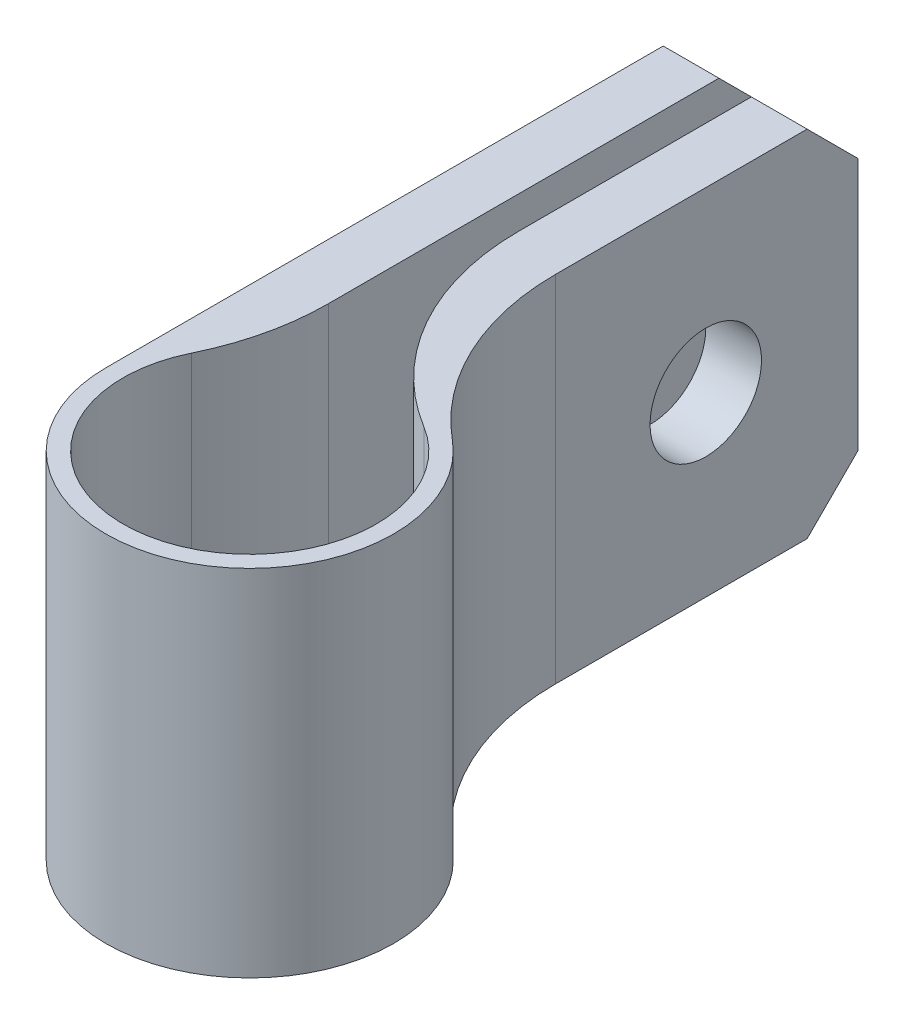
ISO-10303-21;
HEADER;
FILE_DESCRIPTION(('STEP AP214'),'2;1');
FILE_NAME('part.step','',(''),(''),'','','');
FILE_SCHEMA(('AUTOMOTIVE_DESIGN { 1 0 10303 214 1 1 1 1 }'));
ENDSEC;
DATA;
#1=APPLICATION_CONTEXT('core data for automotive mechanical design processes');
#2=APPLICATION_PROTOCOL_DEFINITION('international standard','automotive_design',2000,#1);
#3=PRODUCT_CONTEXT('',#1,'mechanical');
#4=PRODUCT('Part','Part','',(#3));
#5=PRODUCT_RELATED_PRODUCT_CATEGORY('part','',(#4));
#6=PRODUCT_DEFINITION_FORMATION('','',#4);
#7=PRODUCT_DEFINITION_CONTEXT('part definition',#1,'design');
#8=PRODUCT_DEFINITION('design','',#6,#7);
#9=PRODUCT_DEFINITION_SHAPE('','',#8);
#10=(LENGTH_UNIT() NAMED_UNIT(*) SI_UNIT(.MILLI.,.METRE.));
#11=(NAMED_UNIT(*) PLANE_ANGLE_UNIT() SI_UNIT($,.RADIAN.));
#12=(NAMED_UNIT(*) SI_UNIT($,.STERADIAN.) SOLID_ANGLE_UNIT());
#13=UNCERTAINTY_MEASURE_WITH_UNIT(LENGTH_MEASURE(1.E-05),#10,'distance_accuracy_value','');
#14=(GEOMETRIC_REPRESENTATION_CONTEXT(3) GLOBAL_UNCERTAINTY_ASSIGNED_CONTEXT((#13)) GLOBAL_UNIT_ASSIGNED_CONTEXT((#10,
#11,#12)) REPRESENTATION_CONTEXT('',''));
#15=CARTESIAN_POINT('',(0.,0.,0.));
#16=DIRECTION('',(0.,0.,1.));
#17=DIRECTION('',(1.,0.,0.));
#18=AXIS2_PLACEMENT_3D('',#15,#16,#17);
#19=CARTESIAN_POINT('',(0.,7.,0.));
#20=DIRECTION('',(0.,-1.,0.));
#21=DIRECTION('',(0.,0.,-1.));
#22=AXIS2_PLACEMENT_3D('',#19,#20,#21);
#23=CYLINDRICAL_SURFACE('',#22,5.68);
#24=CARTESIAN_POINT('',(0.,-7.,0.));
#25=DIRECTION('',(0.,1.,0.));
#26=DIRECTION('',(0.,0.,1.));
#27=AXIS2_PLACEMENT_3D('',#24,#25,#26);
#28=CIRCLE('',#27,5.68);
#29=CARTESIAN_POINT('',(-5.68,-7.,0.));
#30=VERTEX_POINT('',#29);
#31=CARTESIAN_POINT('',(3.62244897959184,-7.,-4.3749586729767));
#32=VERTEX_POINT('',#31);
#33=EDGE_CURVE('E164',#30,#32,#28,.T.);
#34=ORIENTED_EDGE('',*,*,#33,.T.);
#35=DIRECTION('',(0.,-1.,0.));
#36=VECTOR('',#35,1.);
#37=CARTESIAN_POINT('',(3.62244897959184,7.,-4.3749586729767));
#38=LINE('',#37,#36);
#39=CARTESIAN_POINT('',(3.62244897959184,7.,-4.3749586729767));
#40=VERTEX_POINT('',#39);
#41=EDGE_CURVE('E149',#32,#40,#38,.F.);
#42=ORIENTED_EDGE('',*,*,#41,.T.);
#43=CARTESIAN_POINT('',(0.,7.,0.));
#44=DIRECTION('',(0.,1.,0.));
#45=DIRECTION('',(0.,0.,1.));
#46=AXIS2_PLACEMENT_3D('',#43,#44,#45);
#47=CIRCLE('',#46,5.68);
#48=CARTESIAN_POINT('',(-5.68,7.,0.));
#49=VERTEX_POINT('',#48);
#50=EDGE_CURVE('E131',#49,#40,#47,.T.);
#51=ORIENTED_EDGE('',*,*,#50,.F.);
#52=DIRECTION('',(0.,-1.,0.));
#53=VECTOR('',#52,1.);
#54=CARTESIAN_POINT('',(-5.68,7.,0.));
#55=LINE('',#54,#53);
#56=EDGE_CURVE('E137',#49,#30,#55,.T.);
#57=ORIENTED_EDGE('',*,*,#56,.T.);
#58=EDGE_LOOP('',(#34,#42,#51,#57));
#59=FACE_BOUND('',#58,.T.);
#60=ADVANCED_FACE('F17',(#59),#23,.T.);
#61=CARTESIAN_POINT('',(0.,7.,-24.));
#62=DIRECTION('',(-1.,0.,0.));
#63=DIRECTION('',(0.,0.,1.));
#64=AXIS2_PLACEMENT_3D('',#61,#62,#63);
#65=PLANE('',#64);
#66=CARTESIAN_POINT('',(0.,0.,-18.));
#67=DIRECTION('',(-1.,0.,0.));
#68=DIRECTION('',(0.,0.,1.));
#69=AXIS2_PLACEMENT_3D('',#66,#67,#68);
#70=CIRCLE('',#69,2.2);
#71=CARTESIAN_POINT('',(0.,0.,-15.8));
#72=VERTEX_POINT('',#71);
#73=EDGE_CURVE('E157',#72,#72,#70,.T.);
#74=ORIENTED_EDGE('',*,*,#73,.T.);
#75=EDGE_LOOP('',(#74));
#76=FACE_BOUND('',#75,.T.);
#77=DIRECTION('',(0.,-1.,0.));
#78=VECTOR('',#77,1.);
#79=CARTESIAN_POINT('',(0.,7.,-24.));
#80=LINE('',#79,#78);
#81=CARTESIAN_POINT('',(0.,5.,-24.));
#82=VERTEX_POINT('',#81);
#83=CARTESIAN_POINT('',(0.,-5.,-24.));
#84=VERTEX_POINT('',#83);
#85=EDGE_CURVE('E181',#82,#84,#80,.T.);
#86=ORIENTED_EDGE('',*,*,#85,.F.);
#87=DIRECTION('',(0.,0.707106781186549,0.707106781186546));
#88=VECTOR('',#87,1.);
#89=CARTESIAN_POINT('',(0.,7.,-22.));
#90=LINE('',#89,#88);
#91=CARTESIAN_POINT('',(0.,7.,-22.));
#92=VERTEX_POINT('',#91);
#93=EDGE_CURVE('E229',#82,#92,#90,.T.);
#94=ORIENTED_EDGE('',*,*,#93,.T.);
#95=DIRECTION('',(0.,0.,-1.));
#96=VECTOR('',#95,1.);
#97=CARTESIAN_POINT('',(0.,7.,-24.));
#98=LINE('',#97,#96);
#99=CARTESIAN_POINT('',(0.,7.,-12.0773507028653));
#100=VERTEX_POINT('',#99);
#101=EDGE_CURVE('E150',#100,#92,#98,.T.);
#102=ORIENTED_EDGE('',*,*,#101,.F.);
#103=DIRECTION('',(0.,1.,0.));
#104=VECTOR('',#103,1.);
#105=CARTESIAN_POINT('',(0.,-7.,-12.0773507028653));
#106=LINE('',#105,#104);
#107=CARTESIAN_POINT('',(0.,-7.,-12.0773507028653));
#108=VERTEX_POINT('',#107);
#109=EDGE_CURVE('E184',#100,#108,#106,.F.);
#110=ORIENTED_EDGE('',*,*,#109,.T.);
#111=DIRECTION('',(0.,0.,-1.));
#112=VECTOR('',#111,1.);
#113=CARTESIAN_POINT('',(0.,-7.,-24.));
#114=LINE('',#113,#112);
#115=CARTESIAN_POINT('',(0.,-7.,-22.));
#116=VERTEX_POINT('',#115);
#117=EDGE_CURVE('E166',#108,#116,#114,.T.);
#118=ORIENTED_EDGE('',*,*,#117,.T.);
#119=DIRECTION('',(0.,-0.707106781186546,0.707106781186549));
#120=VECTOR('',#119,1.);
#121=CARTESIAN_POINT('',(0.,-5.,-24.));
#122=LINE('',#121,#120);
#123=EDGE_CURVE('E227',#116,#84,#122,.F.);
#124=ORIENTED_EDGE('',*,*,#123,.T.);
#125=EDGE_LOOP('',(#86,#94,#102,#110,#118,#124));
#126=FACE_BOUND('',#125,.T.);
#127=ADVANCED_FACE('F250',(#76,#126),#65,.F.);
#128=CARTESIAN_POINT('',(-2.2,7.,-24.));
#129=DIRECTION('',(0.,0.,1.));
#130=DIRECTION('',(1.,0.,0.));
#131=AXIS2_PLACEMENT_3D('',#128,#129,#130);
#132=PLANE('',#131);
#133=DIRECTION('',(0.,-1.,0.));
#134=VECTOR('',#133,1.);
#135=CARTESIAN_POINT('',(-2.2,7.,-24.));
#136=LINE('',#135,#134);
#137=CARTESIAN_POINT('',(-2.2,5.,-24.));
#138=VERTEX_POINT('',#137);
#139=CARTESIAN_POINT('',(-2.2,-5.,-24.));
#140=VERTEX_POINT('',#139);
#141=EDGE_CURVE('E178',#138,#140,#136,.T.);
#142=ORIENTED_EDGE('',*,*,#141,.F.);
#143=DIRECTION('',(1.,0.,0.));
#144=VECTOR('',#143,1.);
#145=CARTESIAN_POINT('',(0.,5.,-24.));
#146=LINE('',#145,#144);
#147=EDGE_CURVE('E225',#138,#82,#146,.T.);
#148=ORIENTED_EDGE('',*,*,#147,.T.);
#149=ORIENTED_EDGE('',*,*,#85,.T.);
#150=DIRECTION('',(-1.,0.,0.));
#151=VECTOR('',#150,1.);
#152=CARTESIAN_POINT('',(-2.2,-5.,-24.));
#153=LINE('',#152,#151);
#154=EDGE_CURVE('E222',#84,#140,#153,.T.);
#155=ORIENTED_EDGE('',*,*,#154,.T.);
#156=EDGE_LOOP('',(#142,#148,#149,#155));
#157=FACE_BOUND('',#156,.T.);
#158=ADVANCED_FACE('F256',(#157),#132,.F.);
#159=CARTESIAN_POINT('',(-2.2,7.,-24.));
#160=DIRECTION('',(1.,0.,0.));
#161=DIRECTION('',(0.,0.,-1.));
#162=AXIS2_PLACEMENT_3D('',#159,#160,#161);
#163=PLANE('',#162);
#164=CARTESIAN_POINT('',(-2.2,0.,-18.));
#165=DIRECTION('',(1.,0.,0.));
#166=DIRECTION('',(0.,0.,-1.));
#167=AXIS2_PLACEMENT_3D('',#164,#165,#166);
#168=CIRCLE('',#167,2.2);
#169=CARTESIAN_POINT('',(-2.2,0.,-20.2));
#170=VERTEX_POINT('',#169);
#171=EDGE_CURVE('E457',#170,#170,#168,.T.);
#172=ORIENTED_EDGE('',*,*,#171,.T.);
#173=EDGE_LOOP('',(#172));
#174=FACE_BOUND('',#173,.T.);
#175=DIRECTION('',(0.,0.,1.));
#176=VECTOR('',#175,1.);
#177=CARTESIAN_POINT('',(-2.2,7.,-24.));
#178=LINE('',#177,#176);
#179=CARTESIAN_POINT('',(-2.2,7.,-22.));
#180=VERTEX_POINT('',#179);
#181=CARTESIAN_POINT('',(-2.2,7.,-12.8124939024376));
#182=VERTEX_POINT('',#181);
#183=EDGE_CURVE('E152',#180,#182,#178,.T.);
#184=ORIENTED_EDGE('',*,*,#183,.F.);
#185=DIRECTION('',(0.,-0.707106781186549,-0.707106781186546));
#186=VECTOR('',#185,1.);
#187=CARTESIAN_POINT('',(-2.2,7.,-22.));
#188=LINE('',#187,#186);
#189=EDGE_CURVE('E220',#180,#138,#188,.T.);
#190=ORIENTED_EDGE('',*,*,#189,.T.);
#191=ORIENTED_EDGE('',*,*,#141,.T.);
#192=DIRECTION('',(0.,0.707106781186546,-0.707106781186549));
#193=VECTOR('',#192,1.);
#194=CARTESIAN_POINT('',(-2.2,-5.,-24.));
#195=LINE('',#194,#193);
#196=CARTESIAN_POINT('',(-2.2,-7.,-22.));
#197=VERTEX_POINT('',#196);
#198=EDGE_CURVE('E218',#140,#197,#195,.F.);
#199=ORIENTED_EDGE('',*,*,#198,.T.);
#200=DIRECTION('',(0.,0.,1.));
#201=VECTOR('',#200,1.);
#202=CARTESIAN_POINT('',(-2.2,-7.,-24.));
#203=LINE('',#202,#201);
#204=CARTESIAN_POINT('',(-2.2,-7.,-12.8124939024376));
#205=VERTEX_POINT('',#204);
#206=EDGE_CURVE('E169',#197,#205,#203,.T.);
#207=ORIENTED_EDGE('',*,*,#206,.T.);
#208=DIRECTION('',(0.,-1.,0.));
#209=VECTOR('',#208,1.);
#210=CARTESIAN_POINT('',(-2.2,7.,-12.8124939024376));
#211=LINE('',#210,#209);
#212=EDGE_CURVE('E209',#205,#182,#211,.F.);
#213=ORIENTED_EDGE('',*,*,#212,.T.);
#214=EDGE_LOOP('',(#184,#190,#191,#199,#207,#213));
#215=FACE_BOUND('',#214,.T.);
#216=ADVANCED_FACE('F260',(#174,#215),#163,.F.);
#217=CARTESIAN_POINT('',(0.,7.,0.));
#218=DIRECTION('',(0.,-1.,0.));
#219=DIRECTION('',(0.,0.,-1.));
#220=AXIS2_PLACEMENT_3D('',#217,#218,#219);
#221=CYLINDRICAL_SURFACE('',#220,5.);
#222=CARTESIAN_POINT('',(0.,7.,0.));
#223=DIRECTION('',(0.,-1.,0.));
#224=DIRECTION('',(0.,0.,1.));
#225=AXIS2_PLACEMENT_3D('',#222,#223,#224);
#226=CIRCLE('',#225,5.);
#227=CARTESIAN_POINT('',(2.6,7.,-4.27083130081253));
#228=VERTEX_POINT('',#227);
#229=CARTESIAN_POINT('',(-4.49333333333333,7.,-2.19316108746156));
#230=VERTEX_POINT('',#229);
#231=EDGE_CURVE('E161',#228,#230,#226,.T.);
#232=ORIENTED_EDGE('',*,*,#231,.F.);
#233=DIRECTION('',(0.,-1.,0.));
#234=VECTOR('',#233,1.);
#235=CARTESIAN_POINT('',(2.6,7.,-4.27083130081253));
#236=LINE('',#235,#234);
#237=CARTESIAN_POINT('',(2.6,-7.,-4.27083130081253));
#238=VERTEX_POINT('',#237);
#239=EDGE_CURVE('E203',#228,#238,#236,.T.);
#240=ORIENTED_EDGE('',*,*,#239,.T.);
#241=CARTESIAN_POINT('',(0.,-7.,0.));
#242=DIRECTION('',(0.,-1.,0.));
#243=DIRECTION('',(0.,0.,1.));
#244=AXIS2_PLACEMENT_3D('',#241,#242,#243);
#245=CIRCLE('',#244,5.);
#246=CARTESIAN_POINT('',(-4.49333333333333,-7.,-2.19316108746156));
#247=VERTEX_POINT('',#246);
#248=EDGE_CURVE('E171',#238,#247,#245,.T.);
#249=ORIENTED_EDGE('',*,*,#248,.T.);
#250=DIRECTION('',(0.,-1.,0.));
#251=VECTOR('',#250,1.);
#252=CARTESIAN_POINT('',(-4.49333333333333,7.,-2.19316108746156));
#253=LINE('',#252,#251);
#254=EDGE_CURVE('E194',#247,#230,#253,.F.);
#255=ORIENTED_EDGE('',*,*,#254,.T.);
#256=EDGE_LOOP('',(#232,#240,#249,#255));
#257=FACE_BOUND('',#256,.T.);
#258=ADVANCED_FACE('F288',(#257),#221,.F.);
#259=CARTESIAN_POINT('',(-3.48,7.,-24.));
#260=DIRECTION('',(-1.,0.,0.));
#261=DIRECTION('',(0.,0.,1.));
#262=AXIS2_PLACEMENT_3D('',#259,#260,#261);
#263=PLANE('',#262);
#264=CARTESIAN_POINT('',(-3.48,0.,-18.));
#265=DIRECTION('',(-1.,0.,0.));
#266=DIRECTION('',(0.,0.,1.));
#267=AXIS2_PLACEMENT_3D('',#264,#265,#266);
#268=CIRCLE('',#267,2.2);
#269=CARTESIAN_POINT('',(-3.48,0.,-15.8));
#270=VERTEX_POINT('',#269);
#271=EDGE_CURVE('E460',#270,#270,#268,.T.);
#272=ORIENTED_EDGE('',*,*,#271,.T.);
#273=EDGE_LOOP('',(#272));
#274=FACE_BOUND('',#273,.T.);
#275=DIRECTION('',(0.,-1.,0.));
#276=VECTOR('',#275,1.);
#277=CARTESIAN_POINT('',(-3.48,7.,-24.));
#278=LINE('',#277,#276);
#279=CARTESIAN_POINT('',(-3.48,5.,-24.));
#280=VERTEX_POINT('',#279);
#281=CARTESIAN_POINT('',(-3.48,-5.,-24.));
#282=VERTEX_POINT('',#281);
#283=EDGE_CURVE('E176',#280,#282,#278,.T.);
#284=ORIENTED_EDGE('',*,*,#283,.F.);
#285=DIRECTION('',(0.,0.70710678118655,0.707106781186546));
#286=VECTOR('',#285,1.);
#287=CARTESIAN_POINT('',(-3.48,7.,-22.));
#288=LINE('',#287,#286);
#289=CARTESIAN_POINT('',(-3.48,7.,-22.));
#290=VERTEX_POINT('',#289);
#291=EDGE_CURVE('E241',#280,#290,#288,.T.);
#292=ORIENTED_EDGE('',*,*,#291,.T.);
#293=DIRECTION('',(0.,0.,-1.));
#294=VECTOR('',#293,1.);
#295=CARTESIAN_POINT('',(-3.48,7.,-24.));
#296=LINE('',#295,#294);
#297=CARTESIAN_POINT('',(-3.48,7.,-6.57948326238469));
#298=VERTEX_POINT('',#297);
#299=EDGE_CURVE('E138',#298,#290,#296,.T.);
#300=ORIENTED_EDGE('',*,*,#299,.F.);
#301=DIRECTION('',(0.,-1.,0.));
#302=VECTOR('',#301,1.);
#303=CARTESIAN_POINT('',(-3.48,7.,-6.57948326238468));
#304=LINE('',#303,#302);
#305=CARTESIAN_POINT('',(-3.48,-7.,-6.57948326238469));
#306=VERTEX_POINT('',#305);
#307=EDGE_CURVE('E188',#298,#306,#304,.T.);
#308=ORIENTED_EDGE('',*,*,#307,.T.);
#309=DIRECTION('',(0.,0.,-1.));
#310=VECTOR('',#309,1.);
#311=CARTESIAN_POINT('',(-3.48,-7.,-24.));
#312=LINE('',#311,#310);
#313=CARTESIAN_POINT('',(-3.48,-7.,-22.));
#314=VERTEX_POINT('',#313);
#315=EDGE_CURVE('E154',#306,#314,#312,.T.);
#316=ORIENTED_EDGE('',*,*,#315,.T.);
#317=DIRECTION('',(0.,-0.707106781186546,0.707106781186549));
#318=VECTOR('',#317,1.);
#319=CARTESIAN_POINT('',(-3.48,-5.,-24.));
#320=LINE('',#319,#318);
#321=EDGE_CURVE('E37',#314,#282,#320,.F.);
#322=ORIENTED_EDGE('',*,*,#321,.T.);
#323=EDGE_LOOP('',(#284,#292,#300,#308,#316,#322));
#324=FACE_BOUND('',#323,.T.);
#325=ADVANCED_FACE('F277',(#274,#324),#263,.F.);
#326=CARTESIAN_POINT('',(-5.68,7.,-24.));
#327=DIRECTION('',(0.,0.,1.));
#328=DIRECTION('',(1.,0.,0.));
#329=AXIS2_PLACEMENT_3D('',#326,#327,#328);
#330=PLANE('',#329);
#331=DIRECTION('',(0.,-1.,0.));
#332=VECTOR('',#331,1.);
#333=CARTESIAN_POINT('',(-5.68,7.,-24.));
#334=LINE('',#333,#332);
#335=CARTESIAN_POINT('',(-5.68,5.,-24.));
#336=VERTEX_POINT('',#335);
#337=CARTESIAN_POINT('',(-5.68,-5.,-24.));
#338=VERTEX_POINT('',#337);
#339=EDGE_CURVE('E146',#336,#338,#334,.T.);
#340=ORIENTED_EDGE('',*,*,#339,.F.);
#341=DIRECTION('',(1.,0.,0.));
#342=VECTOR('',#341,1.);
#343=CARTESIAN_POINT('',(-3.48,5.,-24.));
#344=LINE('',#343,#342);
#345=EDGE_CURVE('E238',#336,#280,#344,.T.);
#346=ORIENTED_EDGE('',*,*,#345,.T.);
#347=ORIENTED_EDGE('',*,*,#283,.T.);
#348=DIRECTION('',(-1.,0.,0.));
#349=VECTOR('',#348,1.);
#350=CARTESIAN_POINT('',(-5.68,-5.,-24.));
#351=LINE('',#350,#349);
#352=EDGE_CURVE('E235',#282,#338,#351,.T.);
#353=ORIENTED_EDGE('',*,*,#352,.T.);
#354=EDGE_LOOP('',(#340,#346,#347,#353));
#355=FACE_BOUND('',#354,.T.);
#356=ADVANCED_FACE('F272',(#355),#330,.F.);
#357=CARTESIAN_POINT('',(-5.68,7.,0.));
#358=DIRECTION('',(1.,0.,0.));
#359=DIRECTION('',(0.,0.,-1.));
#360=AXIS2_PLACEMENT_3D('',#357,#358,#359);
#361=PLANE('',#360);
#362=CARTESIAN_POINT('',(-5.68,0.,-18.));
#363=DIRECTION('',(1.,0.,0.));
#364=DIRECTION('',(0.,0.,-1.));
#365=AXIS2_PLACEMENT_3D('',#362,#363,#364);
#366=CIRCLE('',#365,2.2);
#367=CARTESIAN_POINT('',(-5.68,0.,-20.2));
#368=VERTEX_POINT('',#367);
#369=EDGE_CURVE('E462',#368,#368,#366,.T.);
#370=ORIENTED_EDGE('',*,*,#369,.T.);
#371=EDGE_LOOP('',(#370));
#372=FACE_BOUND('',#371,.T.);
#373=DIRECTION('',(0.,0.,1.));
#374=VECTOR('',#373,1.);
#375=CARTESIAN_POINT('',(-5.68,7.,0.));
#376=LINE('',#375,#374);
#377=CARTESIAN_POINT('',(-5.68,7.,-22.));
#378=VERTEX_POINT('',#377);
#379=EDGE_CURVE('E126',#378,#49,#376,.T.);
#380=ORIENTED_EDGE('',*,*,#379,.F.);
#381=DIRECTION('',(0.,-0.707106781186549,-0.707106781186546));
#382=VECTOR('',#381,1.);
#383=CARTESIAN_POINT('',(-5.68,7.,-22.));
#384=LINE('',#383,#382);
#385=EDGE_CURVE('E233',#378,#336,#384,.T.);
#386=ORIENTED_EDGE('',*,*,#385,.T.);
#387=ORIENTED_EDGE('',*,*,#339,.T.);
#388=DIRECTION('',(0.,0.707106781186546,-0.707106781186549));
#389=VECTOR('',#388,1.);
#390=CARTESIAN_POINT('',(-5.68,-5.,-24.));
#391=LINE('',#390,#389);
#392=CARTESIAN_POINT('',(-5.68,-7.,-22.));
#393=VERTEX_POINT('',#392);
#394=EDGE_CURVE('E231',#338,#393,#391,.F.);
#395=ORIENTED_EDGE('',*,*,#394,.T.);
#396=DIRECTION('',(0.,0.,1.));
#397=VECTOR('',#396,1.);
#398=CARTESIAN_POINT('',(-5.68,-7.,0.));
#399=LINE('',#398,#397);
#400=EDGE_CURVE('E142',#393,#30,#399,.T.);
#401=ORIENTED_EDGE('',*,*,#400,.T.);
#402=ORIENTED_EDGE('',*,*,#56,.F.);
#403=EDGE_LOOP('',(#380,#386,#387,#395,#401,#402));
#404=FACE_BOUND('',#403,.T.);
#405=ADVANCED_FACE('F141',(#372,#404),#361,.F.);
#406=CARTESIAN_POINT('',(0.,7.,0.));
#407=DIRECTION('',(0.,1.,0.));
#408=DIRECTION('',(0.,0.,1.));
#409=AXIS2_PLACEMENT_3D('',#406,#407,#408);
#410=PLANE('',#409);
#411=ORIENTED_EDGE('',*,*,#101,.T.);
#412=DIRECTION('',(-1.,0.,0.));
#413=VECTOR('',#412,1.);
#414=CARTESIAN_POINT('',(-2.2,7.,-22.));
#415=LINE('',#414,#413);
#416=EDGE_CURVE('E215',#92,#180,#415,.T.);
#417=ORIENTED_EDGE('',*,*,#416,.T.);
#418=ORIENTED_EDGE('',*,*,#183,.T.);
#419=CARTESIAN_POINT('',(7.8,7.,-12.8124939024376));
#420=DIRECTION('',(0.,1.,0.));
#421=DIRECTION('',(0.,0.,1.));
#422=AXIS2_PLACEMENT_3D('',#419,#420,#421);
#423=CIRCLE('',#422,10.);
#424=EDGE_CURVE('E212',#182,#228,#423,.T.);
#425=ORIENTED_EDGE('',*,*,#424,.T.);
#426=ORIENTED_EDGE('',*,*,#231,.T.);
#427=CARTESIAN_POINT('',(-13.48,7.,-6.57948326238468));
#428=DIRECTION('',(0.,1.,0.));
#429=DIRECTION('',(0.,0.,1.));
#430=AXIS2_PLACEMENT_3D('',#427,#428,#429);
#431=CIRCLE('',#430,10.);
#432=EDGE_CURVE('E197',#230,#298,#431,.T.);
#433=ORIENTED_EDGE('',*,*,#432,.T.);
#434=ORIENTED_EDGE('',*,*,#299,.T.);
#435=DIRECTION('',(-1.,0.,0.));
#436=VECTOR('',#435,1.);
#437=CARTESIAN_POINT('',(-5.68,7.,-22.));
#438=LINE('',#437,#436);
#439=EDGE_CURVE('E135',#290,#378,#438,.T.);
#440=ORIENTED_EDGE('',*,*,#439,.T.);
#441=ORIENTED_EDGE('',*,*,#379,.T.);
#442=ORIENTED_EDGE('',*,*,#50,.T.);
#443=CARTESIAN_POINT('',(10.,7.,-12.0773507028653));
#444=DIRECTION('',(0.,1.,0.));
#445=DIRECTION('',(0.,0.,1.));
#446=AXIS2_PLACEMENT_3D('',#443,#444,#445);
#447=CIRCLE('',#446,10.);
#448=EDGE_CURVE('E201',#40,#100,#447,.F.);
#449=ORIENTED_EDGE('',*,*,#448,.T.);
#450=EDGE_LOOP('',(#411,#417,#418,#425,#426,#433,#434,#440,#441,#442,#449));
#451=FACE_BOUND('',#450,.T.);
#452=ADVANCED_FACE('F129',(#451),#410,.T.);
#453=CARTESIAN_POINT('',(0.,-7.,0.));
#454=DIRECTION('',(0.,1.,0.));
#455=DIRECTION('',(0.,0.,1.));
#456=AXIS2_PLACEMENT_3D('',#453,#454,#455);
#457=PLANE('',#456);
#458=ORIENTED_EDGE('',*,*,#400,.F.);
#459=DIRECTION('',(1.,0.,0.));
#460=VECTOR('',#459,1.);
#461=CARTESIAN_POINT('',(0.,-7.,-22.));
#462=LINE('',#461,#460);
#463=EDGE_CURVE('E11',#393,#314,#462,.T.);
#464=ORIENTED_EDGE('',*,*,#463,.T.);
#465=ORIENTED_EDGE('',*,*,#315,.F.);
#466=CARTESIAN_POINT('',(-13.48,-7.,-6.57948326238468));
#467=DIRECTION('',(0.,1.,0.));
#468=DIRECTION('',(0.,0.,1.));
#469=AXIS2_PLACEMENT_3D('',#466,#467,#468);
#470=CIRCLE('',#469,10.);
#471=EDGE_CURVE('E191',#306,#247,#470,.F.);
#472=ORIENTED_EDGE('',*,*,#471,.T.);
#473=ORIENTED_EDGE('',*,*,#248,.F.);
#474=CARTESIAN_POINT('',(7.8,-7.,-12.8124939024376));
#475=DIRECTION('',(0.,1.,0.));
#476=DIRECTION('',(0.,0.,1.));
#477=AXIS2_PLACEMENT_3D('',#474,#475,#476);
#478=CIRCLE('',#477,10.);
#479=EDGE_CURVE('E206',#238,#205,#478,.F.);
#480=ORIENTED_EDGE('',*,*,#479,.T.);
#481=ORIENTED_EDGE('',*,*,#206,.F.);
#482=DIRECTION('',(1.,0.,0.));
#483=VECTOR('',#482,1.);
#484=CARTESIAN_POINT('',(0.,-7.,-22.));
#485=LINE('',#484,#483);
#486=EDGE_CURVE('E25',#197,#116,#485,.T.);
#487=ORIENTED_EDGE('',*,*,#486,.T.);
#488=ORIENTED_EDGE('',*,*,#117,.F.);
#489=CARTESIAN_POINT('',(10.,-7.,-12.0773507028653));
#490=DIRECTION('',(0.,1.,0.));
#491=DIRECTION('',(0.,0.,1.));
#492=AXIS2_PLACEMENT_3D('',#489,#490,#491);
#493=CIRCLE('',#492,10.);
#494=EDGE_CURVE('E199',#108,#32,#493,.T.);
#495=ORIENTED_EDGE('',*,*,#494,.T.);
#496=ORIENTED_EDGE('',*,*,#33,.F.);
#497=EDGE_LOOP('',(#458,#464,#465,#472,#473,#480,#481,#487,#488,#495,#496));
#498=FACE_BOUND('',#497,.T.);
#499=ADVANCED_FACE('F245',(#498),#457,.F.);
#500=CARTESIAN_POINT('',(10.,7.,-12.0773507028653));
#501=DIRECTION('',(0.,-1.,0.));
#502=DIRECTION('',(0.,0.,-1.));
#503=AXIS2_PLACEMENT_3D('',#500,#501,#502);
#504=CYLINDRICAL_SURFACE('',#503,10.);
#505=ORIENTED_EDGE('',*,*,#448,.F.);
#506=ORIENTED_EDGE('',*,*,#41,.F.);
#507=ORIENTED_EDGE('',*,*,#494,.F.);
#508=ORIENTED_EDGE('',*,*,#109,.F.);
#509=EDGE_LOOP('',(#505,#506,#507,#508));
#510=FACE_BOUND('',#509,.T.);
#511=ADVANCED_FACE('F266',(#510),#504,.F.);
#512=CARTESIAN_POINT('',(-13.48,7.,-6.57948326238468));
#513=DIRECTION('',(0.,-1.,0.));
#514=DIRECTION('',(0.,0.,-1.));
#515=AXIS2_PLACEMENT_3D('',#512,#513,#514);
#516=CYLINDRICAL_SURFACE('',#515,10.);
#517=ORIENTED_EDGE('',*,*,#432,.F.);
#518=ORIENTED_EDGE('',*,*,#254,.F.);
#519=ORIENTED_EDGE('',*,*,#471,.F.);
#520=ORIENTED_EDGE('',*,*,#307,.F.);
#521=EDGE_LOOP('',(#517,#518,#519,#520));
#522=FACE_BOUND('',#521,.T.);
#523=ADVANCED_FACE('F284',(#522),#516,.T.);
#524=CARTESIAN_POINT('',(7.8,7.,-12.8124939024376));
#525=DIRECTION('',(0.,-1.,0.));
#526=DIRECTION('',(0.,0.,-1.));
#527=AXIS2_PLACEMENT_3D('',#524,#525,#526);
#528=CYLINDRICAL_SURFACE('',#527,10.);
#529=ORIENTED_EDGE('',*,*,#424,.F.);
#530=ORIENTED_EDGE('',*,*,#212,.F.);
#531=ORIENTED_EDGE('',*,*,#479,.F.);
#532=ORIENTED_EDGE('',*,*,#239,.F.);
#533=EDGE_LOOP('',(#529,#530,#531,#532));
#534=FACE_BOUND('',#533,.T.);
#535=ADVANCED_FACE('F292',(#534),#528,.T.);
#536=CARTESIAN_POINT('',(-5.68,0.,-18.));
#537=DIRECTION('',(1.,0.,0.));
#538=DIRECTION('',(0.,0.,-1.));
#539=AXIS2_PLACEMENT_3D('',#536,#537,#538);
#540=CYLINDRICAL_SURFACE('',#539,2.2);
#541=ORIENTED_EDGE('',*,*,#369,.F.);
#542=EDGE_LOOP('',(#541));
#543=FACE_BOUND('',#542,.T.);
#544=ORIENTED_EDGE('',*,*,#271,.F.);
#545=EDGE_LOOP('',(#544));
#546=FACE_BOUND('',#545,.T.);
#547=ADVANCED_FACE('F294',(#543,#546),#540,.F.);
#548=ORIENTED_EDGE('',*,*,#171,.F.);
#549=EDGE_LOOP('',(#548));
#550=FACE_BOUND('',#549,.T.);
#551=ORIENTED_EDGE('',*,*,#73,.F.);
#552=EDGE_LOOP('',(#551));
#553=FACE_BOUND('',#552,.T.);
#554=ADVANCED_FACE('F302',(#550,#553),#540,.F.);
#555=CARTESIAN_POINT('',(0.,7.,-22.));
#556=DIRECTION('',(0.,0.707106781186546,-0.707106781186549));
#557=DIRECTION('',(1.,0.,0.));
#558=AXIS2_PLACEMENT_3D('',#555,#556,#557);
#559=PLANE('',#558);
#560=ORIENTED_EDGE('',*,*,#93,.F.);
#561=ORIENTED_EDGE('',*,*,#147,.F.);
#562=ORIENTED_EDGE('',*,*,#189,.F.);
#563=ORIENTED_EDGE('',*,*,#416,.F.);
#564=EDGE_LOOP('',(#560,#561,#562,#563));
#565=FACE_BOUND('',#564,.T.);
#566=ADVANCED_FACE('F264',(#565),#559,.T.);
#567=CARTESIAN_POINT('',(0.,7.,-22.));
#568=DIRECTION('',(0.,0.707106781186546,-0.707106781186549));
#569=DIRECTION('',(1.,0.,0.));
#570=AXIS2_PLACEMENT_3D('',#567,#568,#569);
#571=PLANE('',#570);
#572=ORIENTED_EDGE('',*,*,#291,.F.);
#573=ORIENTED_EDGE('',*,*,#345,.F.);
#574=ORIENTED_EDGE('',*,*,#385,.F.);
#575=ORIENTED_EDGE('',*,*,#439,.F.);
#576=EDGE_LOOP('',(#572,#573,#574,#575));
#577=FACE_BOUND('',#576,.T.);
#578=ADVANCED_FACE('F276',(#577),#571,.T.);
#579=CARTESIAN_POINT('',(-5.68,-5.,-24.));
#580=DIRECTION('',(0.,0.707106781186549,0.707106781186546));
#581=DIRECTION('',(-1.,0.,0.));
#582=AXIS2_PLACEMENT_3D('',#579,#580,#581);
#583=PLANE('',#582);
#584=ORIENTED_EDGE('',*,*,#321,.F.);
#585=ORIENTED_EDGE('',*,*,#463,.F.);
#586=ORIENTED_EDGE('',*,*,#394,.F.);
#587=ORIENTED_EDGE('',*,*,#352,.F.);
#588=EDGE_LOOP('',(#584,#585,#586,#587));
#589=FACE_BOUND('',#588,.T.);
#590=ADVANCED_FACE('F268',(#589),#583,.F.);
#591=CARTESIAN_POINT('',(-2.2,-5.,-24.));
#592=DIRECTION('',(0.,0.707106781186549,0.707106781186546));
#593=DIRECTION('',(-1.,0.,0.));
#594=AXIS2_PLACEMENT_3D('',#591,#592,#593);
#595=PLANE('',#594);
#596=ORIENTED_EDGE('',*,*,#123,.F.);
#597=ORIENTED_EDGE('',*,*,#486,.F.);
#598=ORIENTED_EDGE('',*,*,#198,.F.);
#599=ORIENTED_EDGE('',*,*,#154,.F.);
#600=EDGE_LOOP('',(#596,#597,#598,#599));
#601=FACE_BOUND('',#600,.T.);
#602=ADVANCED_FACE('F19',(#601),#595,.F.);
#603=CLOSED_SHELL('',(#60,#127,#158,#216,#258,#325,#356,#405,#452,#499,#511,#523,#535,#547,#554,
#566,#578,#590,#602));
#604=MANIFOLD_SOLID_BREP('B1',#603);
#605=ADVANCED_BREP_SHAPE_REPRESENTATION('',(#18,#604),#14);
#606=SHAPE_DEFINITION_REPRESENTATION(#9,#605);
ENDSEC;
END-ISO-10303-21;
